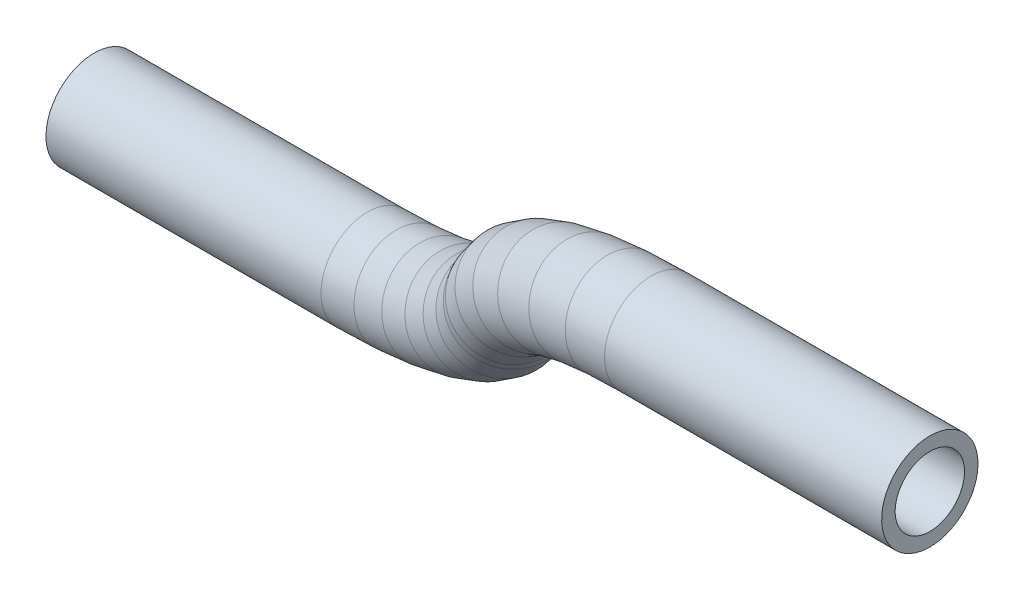
ISO-10303-21;
HEADER;
FILE_DESCRIPTION(('STEP AP214'),'2;1');
FILE_NAME('part.step','',(''),(''),'','','');
FILE_SCHEMA(('AUTOMOTIVE_DESIGN { 1 0 10303 214 1 1 1 1 }'));
ENDSEC;
DATA;
#1=APPLICATION_CONTEXT('core data for automotive mechanical design processes');
#2=APPLICATION_PROTOCOL_DEFINITION('international standard','automotive_design',2000,#1);
#3=PRODUCT_CONTEXT('',#1,'mechanical');
#4=PRODUCT('Part','Part','',(#3));
#5=PRODUCT_RELATED_PRODUCT_CATEGORY('part','',(#4));
#6=PRODUCT_DEFINITION_FORMATION('','',#4);
#7=PRODUCT_DEFINITION_CONTEXT('part definition',#1,'design');
#8=PRODUCT_DEFINITION('design','',#6,#7);
#9=PRODUCT_DEFINITION_SHAPE('','',#8);
#10=(LENGTH_UNIT() NAMED_UNIT(*) SI_UNIT(.MILLI.,.METRE.));
#11=(NAMED_UNIT(*) PLANE_ANGLE_UNIT() SI_UNIT($,.RADIAN.));
#12=(NAMED_UNIT(*) SI_UNIT($,.STERADIAN.) SOLID_ANGLE_UNIT());
#13=UNCERTAINTY_MEASURE_WITH_UNIT(LENGTH_MEASURE(1.E-05),#10,'distance_accuracy_value','');
#14=(GEOMETRIC_REPRESENTATION_CONTEXT(3) GLOBAL_UNCERTAINTY_ASSIGNED_CONTEXT((#13)) GLOBAL_UNIT_ASSIGNED_CONTEXT((#10,
#11,#12)) REPRESENTATION_CONTEXT('',''));
#15=CARTESIAN_POINT('',(0.,0.,0.));
#16=DIRECTION('',(0.,0.,1.));
#17=DIRECTION('',(1.,0.,0.));
#18=AXIS2_PLACEMENT_3D('',#15,#16,#17);
#19=CARTESIAN_POINT('',(-74.8208479167537,-28.,-24.));
#20=DIRECTION('',(-1.,0.,0.));
#21=DIRECTION('',(0.,0.,1.));
#22=AXIS2_PLACEMENT_3D('',#19,#20,#21);
#23=CYLINDRICAL_SURFACE('',#22,3.175);
#24=CARTESIAN_POINT('',(-75.2453160550271,-28.,-24.));
#25=DIRECTION('',(-0.999136472758387,-0.0363487931589792,-0.0201264512473963));
#26=DIRECTION('',(0.0415488724748106,-0.874088821734079,-0.483985973883131));
#27=AXIS2_PLACEMENT_3D('',#24,#25,#26);
#28=ELLIPSE('',#27,3.17774406857008,3.175);
#29=CARTESIAN_POINT('',(-75.1132843719645,-30.7776305686688,-25.5379835577782));
#30=VERTEX_POINT('',#29);
#31=EDGE_CURVE('E45',#30,#30,#28,.T.);
#32=ORIENTED_EDGE('',*,*,#31,.T.);
#33=EDGE_LOOP('',(#32));
#34=FACE_BOUND('',#33,.T.);
#35=CARTESIAN_POINT('',(-93.4453160550271,-28.,-24.));
#36=DIRECTION('',(1.,0.,0.));
#37=DIRECTION('',(0.,0.,-1.));
#38=AXIS2_PLACEMENT_3D('',#35,#36,#37);
#39=CIRCLE('',#38,3.175);
#40=CARTESIAN_POINT('',(-93.4453160550271,-28.,-27.175));
#41=VERTEX_POINT('',#40);
#42=EDGE_CURVE('E98',#41,#41,#39,.T.);
#43=ORIENTED_EDGE('',*,*,#42,.T.);
#44=EDGE_LOOP('',(#43));
#45=FACE_BOUND('',#44,.T.);
#46=ADVANCED_FACE('F39',(#34,#45),#23,.T.);
#47=CARTESIAN_POINT('',(-72.0156653807741,-27.7646021984058,-23.8696594311451));
#48=DIRECTION('',(-0.996547382392144,-0.0726348099717733,-0.0402181430169344));
#49=DIRECTION('',(0.0726936246982249,-0.997354318649212,0.));
#50=AXIS2_PLACEMENT_3D('',#47,#48,#49);
#51=CYLINDRICAL_SURFACE('',#50,3.175);
#52=CARTESIAN_POINT('',(-72.7631361311528,-27.8190826946396,-23.8998254684765));
#53=DIRECTION('',(-0.986213370705267,-0.144768059495844,-0.0801585702963985));
#54=DIRECTION('',(0.165478661591623,-0.862783119905803,-0.477725968064804));
#55=AXIS2_PLACEMENT_3D('',#52,#53,#54);
#56=ELLIPSE('',#55,3.18600003983617,3.175);
#57=CARTESIAN_POINT('',(-72.2359211087298,-30.5679097490294,-25.4218604217617));
#58=VERTEX_POINT('',#57);
#59=EDGE_CURVE('E136',#58,#58,#56,.T.);
#60=ORIENTED_EDGE('',*,*,#59,.T.);
#61=EDGE_LOOP('',(#60));
#62=FACE_BOUND('',#61,.T.);
#63=ORIENTED_EDGE('',*,*,#31,.F.);
#64=EDGE_LOOP('',(#63));
#65=FACE_BOUND('',#64,.T.);
#66=ADVANCED_FACE('F144',(#62,#65),#51,.T.);
#67=CARTESIAN_POINT('',(-69.6225374500946,-27.1193799743117,-23.5123976761215));
#68=DIRECTION('',(-0.96906932372079,-0.215901651517374,-0.119545483793411));
#69=DIRECTION('',(0.217461125033716,-0.976068982756378,0.));
#70=AXIS2_PLACEMENT_3D('',#67,#68,#69);
#71=CYLINDRICAL_SURFACE('',#70,3.175);
#72=CARTESIAN_POINT('',(-70.349397996185,-27.2813192582023,-23.6020640121676));
#73=DIRECTION('',(-0.945233625115691,-0.285544391851714,-0.158106907605852));
#74=DIRECTION('',(0.326394537256141,-0.826932224143323,-0.457875204310877));
#75=AXIS2_PLACEMENT_3D('',#72,#73,#74);
#76=ELLIPSE('',#75,3.18600003983617,3.175);
#77=CARTESIAN_POINT('',(-69.3095049874846,-29.9159253572647,-25.0608544313421));
#78=VERTEX_POINT('',#77);
#79=EDGE_CURVE('E131',#78,#78,#76,.T.);
#80=ORIENTED_EDGE('',*,*,#79,.T.);
#81=EDGE_LOOP('',(#80));
#82=FACE_BOUND('',#81,.T.);
#83=ORIENTED_EDGE('',*,*,#59,.F.);
#84=EDGE_LOOP('',(#83));
#85=FACE_BOUND('',#84,.T.);
#86=ADVANCED_FACE('F150',(#82,#85),#71,.T.);
#87=CARTESIAN_POINT('',(-67.3844478478801,-26.1366047031841,-22.968231643016));
#88=DIRECTION('',(-0.914870865995366,-0.35321538099579,-0.195576566032046));
#89=DIRECTION('',(0.360170843602373,-0.932886361471082,0.));
#90=AXIS2_PLACEMENT_3D('',#87,#88,#89);
#91=CYLINDRICAL_SURFACE('',#90,3.175);
#92=CARTESIAN_POINT('',(-68.0706562758865,-26.4015375809811,-23.1149258847063));
#93=DIRECTION('',(-0.878190708353341,-0.418447334852284,-0.231695722267109));
#94=DIRECTION('',(0.478310651942706,-0.768280112328567,-0.4253993291468));
#95=AXIS2_PLACEMENT_3D('',#92,#93,#94);
#96=ELLIPSE('',#95,3.18600003983617,3.175);
#97=CARTESIAN_POINT('',(-66.546758519743,-28.8492780494652,-24.4702481643143));
#98=VERTEX_POINT('',#97);
#99=EDGE_CURVE('E132',#98,#98,#96,.T.);
#100=ORIENTED_EDGE('',*,*,#99,.T.);
#101=EDGE_LOOP('',(#100));
#102=FACE_BOUND('',#101,.T.);
#103=ORIENTED_EDGE('',*,*,#79,.F.);
#104=EDGE_LOOP('',(#103));
#105=FACE_BOUND('',#104,.T.);
#106=ADVANCED_FACE('F155',(#102,#105),#91,.T.);
#107=CARTESIAN_POINT('',(-65.3631079974791,-24.8433747017092,-22.2521657625749));
#108=DIRECTION('',(-0.835446437305883,-0.480789811436235,-0.266214965041444));
#109=DIRECTION('',(0.498789278388095,-0.866723286732902,0.));
#110=AXIS2_PLACEMENT_3D('',#107,#108,#109);
#111=CYLINDRICAL_SURFACE('',#110,3.175);
#112=CARTESIAN_POINT('',(-65.9897433049697,-25.2039961106642,-22.4518430716497));
#113=DIRECTION('',(-0.786933212098699,-0.539812321282901,-0.298895930864223));
#114=DIRECTION('',(0.617038183337162,-0.688444014307449,-0.381193808276342));
#115=AXIS2_PLACEMENT_3D('',#112,#113,#114);
#116=ELLIPSE('',#115,3.18600003983617,3.175);
#117=CARTESIAN_POINT('',(-64.0238596282771,-27.3973787676727,-23.6663265600034));
#118=VERTEX_POINT('',#117);
#119=EDGE_CURVE('E126',#118,#118,#116,.T.);
#120=ORIENTED_EDGE('',*,*,#119,.T.);
#121=EDGE_LOOP('',(#120));
#122=FACE_BOUND('',#121,.T.);
#123=ORIENTED_EDGE('',*,*,#99,.F.);
#124=EDGE_LOOP('',(#123));
#125=FACE_BOUND('',#124,.T.);
#126=ADVANCED_FACE('F266',(#122,#125),#111,.T.);
#127=CARTESIAN_POINT('',(-63.6142528252838,-23.2753485351333,-21.3839443044868));
#128=DIRECTION('',(-0.732986027962917,-0.595107300078769,-0.329512949979365));
#129=DIRECTION('',(0.630309415582673,-0.77634402208546,0.));
#130=AXIS2_PLACEMENT_3D('',#127,#128,#129);
#131=CYLINDRICAL_SURFACE('',#130,3.175);
#132=CARTESIAN_POINT('',(-64.1640366348838,-23.7217149678843,-21.6310989268685));
#133=DIRECTION('',(-0.67397740289422,-0.646292922989005,-0.357854604668277));
#134=DIRECTION('',(0.738751961342886,-0.589625271455446,-0.326477531957606));
#135=AXIS2_PLACEMENT_3D('',#132,#133,#134);
#136=ELLIPSE('',#135,3.18600003983617,3.175);
#137=CARTESIAN_POINT('',(-61.8103728566164,-25.6002611062297,-22.671256356691));
#138=VERTEX_POINT('',#137);
#139=EDGE_CURVE('E125',#138,#138,#136,.T.);
#140=ORIENTED_EDGE('',*,*,#139,.T.);
#141=EDGE_LOOP('',(#140));
#142=FACE_BOUND('',#141,.T.);
#143=ORIENTED_EDGE('',*,*,#119,.F.);
#144=EDGE_LOOP('',(#143));
#145=FACE_BOUND('',#144,.T.);
#146=ADVANCED_FACE('F265',(#142,#145),#131,.T.);
#147=CARTESIAN_POINT('',(-62.3848177585732,-21.7014023724119,-20.5124449242601));
#148=DIRECTION('',(-0.610314805328465,-0.693015741247752,-0.38372518913893));
#149=DIRECTION('',(0.75046590694347,-0.6609091635887,0.));
#150=AXIS2_PLACEMENT_3D('',#147,#148,#149);
#151=CYLINDRICAL_SURFACE('',#150,3.175);
#152=CARTESIAN_POINT('',(-62.6438769477517,-21.9955654738935,-20.6753240409025));
#153=DIRECTION('',(-0.576874469721973,-0.714601509897064,-0.395677303159821));
#154=DIRECTION('',(0.81683281409539,-0.504675326420293,-0.279440456483269));
#155=AXIS2_PLACEMENT_3D('',#152,#153,#154);
#156=ELLIPSE('',#155,3.17774406857008,3.175);
#157=CARTESIAN_POINT('',(-60.0481913177467,-23.5992944989792,-21.5633142940107));
#158=VERTEX_POINT('',#157);
#159=EDGE_CURVE('E122',#158,#158,#156,.T.);
#160=ORIENTED_EDGE('',*,*,#159,.T.);
#161=EDGE_LOOP('',(#160));
#162=FACE_BOUND('',#161,.T.);
#163=ORIENTED_EDGE('',*,*,#139,.F.);
#164=EDGE_LOOP('',(#163));
#165=FACE_BOUND('',#164,.T.);
#166=ADVANCED_FACE('F256',(#162,#165),#151,.T.);
#167=CARTESIAN_POINT('',(-61.8711915269994,-20.9486481673332,-20.0956423431255));
#168=DIRECTION('',(-0.542437840476289,-0.73495312280499,-0.406946060920381));
#169=DIRECTION('',(0.804588494957021,-0.593832765837989,0.));
#170=AXIS2_PLACEMENT_3D('',#167,#168,#169);
#171=CYLINDRICAL_SURFACE('',#170,3.175);
#172=CARTESIAN_POINT('',(-62.1014391072754,-21.2606123510885,-20.2683779799821));
#173=DIRECTION('',(-0.576874469721973,-0.714601509897064,-0.395677303159821));
#174=DIRECTION('',(-0.816832814095389,0.504675326420297,0.279440456483263));
#175=AXIS2_PLACEMENT_3D('',#172,#173,#174);
#176=ELLIPSE('',#175,3.17774406857008,3.175);
#177=CARTESIAN_POINT('',(-64.6971247372804,-19.6568833260027,-19.3803877268739));
#178=VERTEX_POINT('',#177);
#179=EDGE_CURVE('E116',#178,#178,#176,.T.);
#180=ORIENTED_EDGE('',*,*,#179,.T.);
#181=EDGE_LOOP('',(#180));
#182=FACE_BOUND('',#181,.T.);
#183=ORIENTED_EDGE('',*,*,#159,.F.);
#184=EDGE_LOOP('',(#183));
#185=FACE_BOUND('',#184,.T.);
#186=ADVANCED_FACE('F255',(#182,#185),#171,.T.);
#187=CARTESIAN_POINT('',(-60.1235064395841,-19.0146591776266,-19.0247860166421));
#188=DIRECTION('',(-0.610314805328466,-0.693015741247751,-0.38372518913893));
#189=DIRECTION('',(0.75046590694347,-0.6609091635887,0.));
#190=AXIS2_PLACEMENT_3D('',#187,#188,#189);
#191=CYLINDRICAL_SURFACE('',#190,3.175);
#192=CARTESIAN_POINT('',(-60.5812794201433,-19.5344628570977,-19.3126030940162));
#193=DIRECTION('',(-0.673977402894222,-0.646292922989004,-0.357854604668278));
#194=DIRECTION('',(-0.738751961342885,0.589625271455447,0.326477531957608));
#195=AXIS2_PLACEMENT_3D('',#192,#193,#194);
#196=ELLIPSE('',#195,3.18600003983617,3.175);
#197=CARTESIAN_POINT('',(-62.9349431984108,-17.6559167187522,-18.2724456641936));
#198=VERTEX_POINT('',#197);
#199=EDGE_CURVE('E117',#198,#198,#196,.T.);
#200=ORIENTED_EDGE('',*,*,#199,.T.);
#201=EDGE_LOOP('',(#200));
#202=FACE_BOUND('',#201,.T.);
#203=ORIENTED_EDGE('',*,*,#179,.F.);
#204=EDGE_LOOP('',(#203));
#205=FACE_BOUND('',#204,.T.);
#206=ADVANCED_FACE('F250',(#202,#205),#191,.T.);
#207=CARTESIAN_POINT('',(-58.2057889404573,-17.6058152815667,-18.2447043268533));
#208=DIRECTION('',(-0.732986027962918,-0.595107300078768,-0.329512949979365));
#209=DIRECTION('',(0.630309415582671,-0.776344022085462,0.));
#210=AXIS2_PLACEMENT_3D('',#207,#208,#209);
#211=CYLINDRICAL_SURFACE('',#210,3.175);
#212=CARTESIAN_POINT('',(-58.7555727500574,-18.0521817143177,-18.4918589492349));
#213=DIRECTION('',(-0.7869332120987,-0.5398123212829,-0.298895930864222));
#214=DIRECTION('',(-0.61703818333716,0.688444014307445,0.381193808276351));
#215=AXIS2_PLACEMENT_3D('',#212,#213,#214);
#216=ELLIPSE('',#215,3.18600003983617,3.175);
#217=CARTESIAN_POINT('',(-60.72145642675,-15.8587990573093,-17.2773754608812));
#218=VERTEX_POINT('',#217);
#219=EDGE_CURVE('E114',#218,#218,#216,.T.);
#220=ORIENTED_EDGE('',*,*,#219,.T.);
#221=EDGE_LOOP('',(#220));
#222=FACE_BOUND('',#221,.T.);
#223=ORIENTED_EDGE('',*,*,#199,.F.);
#224=EDGE_LOOP('',(#223));
#225=FACE_BOUND('',#224,.T.);
#226=ADVANCED_FACE('F246',(#222,#225),#211,.T.);
#227=CARTESIAN_POINT('',(-56.04802447165,-16.4940188350458,-17.6290988271036));
#228=DIRECTION('',(-0.835446437305884,-0.480789811436234,-0.266214965041442));
#229=DIRECTION('',(0.498789278388093,-0.866723286732902,0.));
#230=AXIS2_PLACEMENT_3D('',#227,#228,#229);
#231=CYLINDRICAL_SURFACE('',#230,3.175);
#232=CARTESIAN_POINT('',(-56.6746597791406,-16.8546402440008,-17.8287761361783));
#233=DIRECTION('',(-0.878190708353341,-0.418447334852285,-0.231695722267108));
#234=DIRECTION('',(-0.478310651942707,0.768280112328569,0.425399329146797));
#235=AXIS2_PLACEMENT_3D('',#232,#233,#234);
#236=ELLIPSE('',#235,3.18600003983617,3.175);
#237=CARTESIAN_POINT('',(-58.1985575352841,-14.4068997755167,-16.4734538565704));
#238=VERTEX_POINT('',#237);
#239=EDGE_CURVE('E109',#238,#238,#236,.T.);
#240=ORIENTED_EDGE('',*,*,#239,.T.);
#241=EDGE_LOOP('',(#240));
#242=FACE_BOUND('',#241,.T.);
#243=ORIENTED_EDGE('',*,*,#219,.F.);
#244=EDGE_LOOP('',(#243));
#245=FACE_BOUND('',#244,.T.);
#246=ADVANCED_FACE('F245',(#242,#245),#231,.T.);
#247=CARTESIAN_POINT('',(-53.7097096308357,-15.7099256889826,-17.1949437670267));
#248=DIRECTION('',(-0.914870865995365,-0.353215380995792,-0.195576566032046));
#249=DIRECTION('',(0.360170843602375,-0.932886361471081,0.));
#250=AXIS2_PLACEMENT_3D('',#247,#248,#249);
#251=CYLINDRICAL_SURFACE('',#250,3.175);
#252=CARTESIAN_POINT('',(-54.3959180588421,-15.9748585667796,-17.341638008717));
#253=DIRECTION('',(-0.94523362511569,-0.285544391851714,-0.158106907605852));
#254=DIRECTION('',(-0.326394537256141,0.826932224143329,0.457875204310866));
#255=AXIS2_PLACEMENT_3D('',#252,#253,#254);
#256=ELLIPSE('',#255,3.18600003983617,3.175);
#257=CARTESIAN_POINT('',(-55.4358110675425,-13.3402524677172,-15.8828475895426));
#258=VERTEX_POINT('',#257);
#259=EDGE_CURVE('E110',#258,#258,#256,.T.);
#260=ORIENTED_EDGE('',*,*,#259,.T.);
#261=EDGE_LOOP('',(#260));
#262=FACE_BOUND('',#261,.T.);
#263=ORIENTED_EDGE('',*,*,#239,.F.);
#264=EDGE_LOOP('',(#263));
#265=FACE_BOUND('',#264,.T.);
#266=ADVANCED_FACE('F236',(#262,#265),#251,.T.);
#267=CARTESIAN_POINT('',(-51.2553193777839,-15.2751558464517,-16.954210216362));
#268=DIRECTION('',(-0.969069323720791,-0.215901651517371,-0.119545483793411));
#269=DIRECTION('',(0.217461125033713,-0.976068982756379,0.));
#270=AXIS2_PLACEMENT_3D('',#267,#268,#269);
#271=CYLINDRICAL_SURFACE('',#270,3.175);
#272=CARTESIAN_POINT('',(-51.9821799238743,-15.4370951303424,-17.0438765524081));
#273=DIRECTION('',(-0.986213370705268,-0.144768059495843,-0.0801585702963986));
#274=DIRECTION('',(-0.165478661591622,0.862783119905798,0.477725968064813));
#275=AXIS2_PLACEMENT_3D('',#272,#273,#274);
#276=ELLIPSE('',#275,3.18600003983617,3.175);
#277=CARTESIAN_POINT('',(-52.5093949462973,-12.6882680759525,-15.5218415991229));
#278=VERTEX_POINT('',#277);
#279=EDGE_CURVE('E102',#278,#278,#276,.T.);
#280=ORIENTED_EDGE('',*,*,#279,.T.);
#281=EDGE_LOOP('',(#280));
#282=FACE_BOUND('',#281,.T.);
#283=ORIENTED_EDGE('',*,*,#259,.F.);
#284=EDGE_LOOP('',(#283));
#285=FACE_BOUND('',#284,.T.);
#286=ADVANCED_FACE('F233',(#282,#285),#271,.T.);
#287=CARTESIAN_POINT('',(-49.0769973878947,-15.2253466624194,-16.9266307005934));
#288=DIRECTION('',(-0.996547382392144,-0.072634809971774,-0.0402181430169344));
#289=DIRECTION('',(0.0726936246982257,-0.997354318649212,0.));
#290=AXIS2_PLACEMENT_3D('',#287,#288,#289);
#291=CYLINDRICAL_SURFACE('',#290,3.175);
#292=CARTESIAN_POINT('',(-49.5,-15.256177824982,-16.9437020208846));
#293=DIRECTION('',(-0.999136472758387,-0.0363487931589795,-0.0201264512473963));
#294=DIRECTION('',(-0.0415488724748109,0.87408882173408,0.483985973883127));
#295=AXIS2_PLACEMENT_3D('',#292,#293,#294);
#296=ELLIPSE('',#295,3.17774406857008,3.175);
#297=CARTESIAN_POINT('',(-49.6320316830626,-12.4785472563131,-15.4057184631064));
#298=VERTEX_POINT('',#297);
#299=EDGE_CURVE('E101',#298,#298,#296,.T.);
#300=ORIENTED_EDGE('',*,*,#299,.T.);
#301=EDGE_LOOP('',(#300));
#302=FACE_BOUND('',#301,.T.);
#303=ORIENTED_EDGE('',*,*,#279,.F.);
#304=EDGE_LOOP('',(#303));
#305=FACE_BOUND('',#304,.T.);
#306=ADVANCED_FACE('F228',(#302,#305),#291,.T.);
#307=CARTESIAN_POINT('',(-31.3,-15.256177824982,-16.9437020208846));
#308=DIRECTION('',(-1.,0.,0.));
#309=DIRECTION('',(0.,0.,1.));
#310=AXIS2_PLACEMENT_3D('',#307,#308,#309);
#311=CYLINDRICAL_SURFACE('',#310,3.175);
#312=CARTESIAN_POINT('',(-31.3,-15.256177824982,-16.9437020208846));
#313=DIRECTION('',(1.,0.,0.));
#314=DIRECTION('',(0.,0.,-1.));
#315=AXIS2_PLACEMENT_3D('',#312,#313,#314);
#316=CIRCLE('',#315,3.175);
#317=CARTESIAN_POINT('',(-31.3,-15.256177824982,-20.1187020208846));
#318=VERTEX_POINT('',#317);
#319=EDGE_CURVE('E92',#318,#318,#316,.T.);
#320=ORIENTED_EDGE('',*,*,#319,.F.);
#321=EDGE_LOOP('',(#320));
#322=FACE_BOUND('',#321,.T.);
#323=ORIENTED_EDGE('',*,*,#299,.F.);
#324=EDGE_LOOP('',(#323));
#325=FACE_BOUND('',#324,.T.);
#326=ADVANCED_FACE('F227',(#322,#325),#311,.T.);
#327=CARTESIAN_POINT('',(-93.4453160550271,-28.,-24.));
#328=DIRECTION('',(1.,0.,0.));
#329=DIRECTION('',(0.,0.,-1.));
#330=AXIS2_PLACEMENT_3D('',#327,#328,#329);
#331=PLANE('',#330);
#332=CARTESIAN_POINT('',(-93.4453160550271,-28.,-24.));
#333=DIRECTION('',(1.,0.,0.));
#334=DIRECTION('',(0.,0.,-1.));
#335=AXIS2_PLACEMENT_3D('',#332,#333,#334);
#336=CIRCLE('',#335,2.286);
#337=CARTESIAN_POINT('',(-93.4453160550271,-28.,-26.286));
#338=VERTEX_POINT('',#337);
#339=EDGE_CURVE('E95',#338,#338,#336,.F.);
#340=ORIENTED_EDGE('',*,*,#339,.F.);
#341=EDGE_LOOP('',(#340));
#342=FACE_BOUND('',#341,.T.);
#343=ORIENTED_EDGE('',*,*,#42,.F.);
#344=EDGE_LOOP('',(#343));
#345=FACE_BOUND('',#344,.T.);
#346=ADVANCED_FACE('F225',(#342,#345),#331,.F.);
#347=CARTESIAN_POINT('',(-31.3,-15.256177824982,-16.9437020208846));
#348=DIRECTION('',(1.,0.,0.));
#349=DIRECTION('',(0.,0.,-1.));
#350=AXIS2_PLACEMENT_3D('',#347,#348,#349);
#351=PLANE('',#350);
#352=CARTESIAN_POINT('',(-31.3,-15.256177824982,-16.9437020208846));
#353=DIRECTION('',(1.,0.,0.));
#354=DIRECTION('',(0.,0.,-1.));
#355=AXIS2_PLACEMENT_3D('',#352,#353,#354);
#356=CIRCLE('',#355,2.286);
#357=CARTESIAN_POINT('',(-31.3,-15.256177824982,-19.2297020208846));
#358=VERTEX_POINT('',#357);
#359=EDGE_CURVE('E46',#358,#358,#356,.F.);
#360=ORIENTED_EDGE('',*,*,#359,.T.);
#361=EDGE_LOOP('',(#360));
#362=FACE_BOUND('',#361,.T.);
#363=ORIENTED_EDGE('',*,*,#319,.T.);
#364=EDGE_LOOP('',(#363));
#365=FACE_BOUND('',#364,.T.);
#366=ADVANCED_FACE('F217',(#362,#365),#351,.T.);
#367=CARTESIAN_POINT('',(-74.9116989954702,-28.,-24.));
#368=DIRECTION('',(-1.,0.,0.));
#369=DIRECTION('',(0.,0.,1.));
#370=AXIS2_PLACEMENT_3D('',#367,#368,#369);
#371=CYLINDRICAL_SURFACE('',#370,2.286);
#372=CARTESIAN_POINT('',(-75.2453160550271,-28.,-24.));
#373=DIRECTION('',(-0.999136472758387,-0.0363487931589792,-0.0201264512473963));
#374=DIRECTION('',(0.0415488724748106,-0.874088821734078,-0.483985973883131));
#375=AXIS2_PLACEMENT_3D('',#372,#373,#374);
#376=ELLIPSE('',#375,2.28797572937046,2.286);
#377=CARTESIAN_POINT('',(-75.150253243222,-29.9998940094416,-25.1073481616003));
#378=VERTEX_POINT('',#377);
#379=EDGE_CURVE('E90',#378,#378,#376,.F.);
#380=ORIENTED_EDGE('',*,*,#379,.T.);
#381=EDGE_LOOP('',(#380));
#382=FACE_BOUND('',#381,.T.);
#383=ORIENTED_EDGE('',*,*,#339,.T.);
#384=EDGE_LOOP('',(#383));
#385=FACE_BOUND('',#384,.T.);
#386=ADVANCED_FACE('F212',(#382,#385),#371,.F.);
#387=CARTESIAN_POINT('',(-72.1970538641731,-27.777822962672,-23.8769798135934));
#388=DIRECTION('',(-0.996547382392144,-0.0726348099717733,-0.0402181430169344));
#389=DIRECTION('',(0.072693624698225,-0.997354318649212,0.));
#390=AXIS2_PLACEMENT_3D('',#387,#388,#389);
#391=CYLINDRICAL_SURFACE('',#390,2.286);
#392=CARTESIAN_POINT('',(-72.7631361311528,-27.8190826946395,-23.8998254684765));
#393=DIRECTION('',(-0.986213370705267,-0.144768059495844,-0.0801585702963985));
#394=DIRECTION('',(0.165478661591623,-0.862783119905803,-0.477725968064804));
#395=AXIS2_PLACEMENT_3D('',#392,#393,#394);
#396=ELLIPSE('',#395,2.29392002868204,2.286);
#397=CARTESIAN_POINT('',(-72.3835413150082,-29.7982381738003,-24.9956906348418));
#398=VERTEX_POINT('',#397);
#399=EDGE_CURVE('E88',#398,#398,#396,.F.);
#400=ORIENTED_EDGE('',*,*,#399,.T.);
#401=EDGE_LOOP('',(#400));
#402=FACE_BOUND('',#401,.T.);
#403=ORIENTED_EDGE('',*,*,#379,.F.);
#404=EDGE_LOOP('',(#403));
#405=FACE_BOUND('',#404,.T.);
#406=ADVANCED_FACE('F209',(#402,#405),#391,.F.);
#407=CARTESIAN_POINT('',(-69.7989244619357,-27.1586777275585,-23.5341569766682));
#408=DIRECTION('',(-0.96906932372079,-0.215901651517374,-0.119545483793411));
#409=DIRECTION('',(0.217461125033716,-0.976068982756378,0.));
#410=AXIS2_PLACEMENT_3D('',#407,#408,#409);
#411=CYLINDRICAL_SURFACE('',#410,2.286);
#412=CARTESIAN_POINT('',(-70.349397996185,-27.2813192582023,-23.6020640121676));
#413=DIRECTION('',(-0.94523362511569,-0.285544391851714,-0.158106907605852));
#414=DIRECTION('',(0.326394537256141,-0.826932224143322,-0.457875204310877));
#415=AXIS2_PLACEMENT_3D('',#412,#413,#414);
#416=ELLIPSE('',#415,2.29392002868204,2.286);
#417=CARTESIAN_POINT('',(-69.6006750299207,-29.1782356495273,-24.6523931139732));
#418=VERTEX_POINT('',#417);
#419=EDGE_CURVE('E84',#418,#418,#416,.F.);
#420=ORIENTED_EDGE('',*,*,#419,.T.);
#421=EDGE_LOOP('',(#420));
#422=FACE_BOUND('',#421,.T.);
#423=ORIENTED_EDGE('',*,*,#399,.F.);
#424=EDGE_LOOP('',(#423));
#425=FACE_BOUND('',#424,.T.);
#426=ADVANCED_FACE('F206',(#422,#425),#411,.F.);
#427=CARTESIAN_POINT('',(-67.550969823474,-26.2008958782994,-23.0038298868404));
#428=DIRECTION('',(-0.914870865995366,-0.35321538099579,-0.195576566032046));
#429=DIRECTION('',(0.360170843602373,-0.932886361471082,0.));
#430=AXIS2_PLACEMENT_3D('',#427,#428,#429);
#431=CYLINDRICAL_SURFACE('',#430,2.286);
#432=CARTESIAN_POINT('',(-68.0706562758865,-26.4015375809811,-23.1149258847063));
#433=DIRECTION('',(-0.878190708353341,-0.418447334852284,-0.231695722267109));
#434=DIRECTION('',(0.478310651942706,-0.768280112328568,-0.425399329146799));
#435=AXIS2_PLACEMENT_3D('',#432,#433,#434);
#436=ELLIPSE('',#435,2.29392002868204,2.286);
#437=CARTESIAN_POINT('',(-66.9734498914632,-28.1639107182897,-24.090757926024));
#438=VERTEX_POINT('',#437);
#439=EDGE_CURVE('E78',#438,#438,#436,.F.);
#440=ORIENTED_EDGE('',*,*,#439,.T.);
#441=EDGE_LOOP('',(#440));
#442=FACE_BOUND('',#441,.T.);
#443=ORIENTED_EDGE('',*,*,#419,.F.);
#444=EDGE_LOOP('',(#443));
#445=FACE_BOUND('',#444,.T.);
#446=ADVANCED_FACE('F205',(#442,#445),#431,.F.);
#447=CARTESIAN_POINT('',(-65.5151733833319,-24.9308865814964,-22.3006213900947));
#448=DIRECTION('',(-0.835446437305883,-0.480789811436235,-0.266214965041444));
#449=DIRECTION('',(0.498789278388094,-0.866723286732902,0.));
#450=AXIS2_PLACEMENT_3D('',#447,#448,#449);
#451=CYLINDRICAL_SURFACE('',#450,2.286);
#452=CARTESIAN_POINT('',(-65.9897433049697,-25.2039961106642,-22.4518430716497));
#453=DIRECTION('',(-0.786933212098698,-0.539812321282901,-0.298895930864223));
#454=DIRECTION('',(0.617038183337162,-0.688444014307449,-0.381193808276342));
#455=AXIS2_PLACEMENT_3D('',#452,#453,#454);
#456=ELLIPSE('',#455,2.29392002868204,2.286);
#457=CARTESIAN_POINT('',(-64.574307057751,-26.7832316237103,-23.3262711832643));
#458=VERTEX_POINT('',#457);
#459=EDGE_CURVE('E80',#458,#458,#456,.F.);
#460=ORIENTED_EDGE('',*,*,#459,.T.);
#461=EDGE_LOOP('',(#460));
#462=FACE_BOUND('',#461,.T.);
#463=ORIENTED_EDGE('',*,*,#439,.F.);
#464=EDGE_LOOP('',(#463));
#465=FACE_BOUND('',#464,.T.);
#466=ADVANCED_FACE('F196',(#462,#465),#451,.F.);
#467=CARTESIAN_POINT('',(-63.7476686831888,-23.3836681319013,-21.4439212361542));
#468=DIRECTION('',(-0.732986027962917,-0.595107300078769,-0.329512949979365));
#469=DIRECTION('',(0.630309415582673,-0.77634402208546,0.));
#470=AXIS2_PLACEMENT_3D('',#467,#468,#469);
#471=CYLINDRICAL_SURFACE('',#470,2.286);
#472=CARTESIAN_POINT('',(-64.1640366348838,-23.7217149678843,-21.6310989268685));
#473=DIRECTION('',(-0.673977402894221,-0.646292922989005,-0.357854604668277));
#474=DIRECTION('',(0.738751961342886,-0.589625271455446,-0.326477531957607));
#475=AXIS2_PLACEMENT_3D('',#472,#473,#474);
#476=ELLIPSE('',#475,2.29392002868204,2.286);
#477=CARTESIAN_POINT('',(-62.4693987145313,-25.074268187493,-22.3800122763407));
#478=VERTEX_POINT('',#477);
#479=EDGE_CURVE('E74',#478,#478,#476,.F.);
#480=ORIENTED_EDGE('',*,*,#479,.T.);
#481=EDGE_LOOP('',(#480));
#482=FACE_BOUND('',#481,.T.);
#483=ORIENTED_EDGE('',*,*,#459,.F.);
#484=EDGE_LOOP('',(#483));
#485=FACE_BOUND('',#484,.T.);
#486=ADVANCED_FACE('F193',(#482,#485),#471,.F.);
#487=CARTESIAN_POINT('',(-62.440265516994,-21.7643636000718,-20.5473067716241));
#488=DIRECTION('',(-0.610314805328465,-0.693015741247752,-0.38372518913893));
#489=DIRECTION('',(0.75046590694347,-0.660909163588699,0.));
#490=AXIS2_PLACEMENT_3D('',#487,#488,#489);
#491=CYLINDRICAL_SURFACE('',#490,2.286);
#492=CARTESIAN_POINT('',(-62.6438769477517,-21.9955654738935,-20.6753240409025));
#493=DIRECTION('',(-0.576874469721973,-0.714601509897064,-0.395677303159821));
#494=DIRECTION('',(0.81683281409539,-0.504675326420294,-0.279440456483268));
#495=AXIS2_PLACEMENT_3D('',#492,#493,#494);
#496=ELLIPSE('',#495,2.28797572937046,2.286);
#497=CARTESIAN_POINT('',(-60.7749832941481,-23.1502503719552,-21.3146770231404));
#498=VERTEX_POINT('',#497);
#499=EDGE_CURVE('E72',#498,#498,#496,.F.);
#500=ORIENTED_EDGE('',*,*,#499,.T.);
#501=EDGE_LOOP('',(#500));
#502=FACE_BOUND('',#501,.T.);
#503=ORIENTED_EDGE('',*,*,#479,.F.);
#504=EDGE_LOOP('',(#503));
#505=FACE_BOUND('',#504,.T.);
#506=ADVANCED_FACE('F188',(#502,#505),#491,.F.);
#507=CARTESIAN_POINT('',(-61.9204725899433,-21.0154194513461,-20.1326138317396));
#508=DIRECTION('',(-0.542437840476289,-0.734953122804989,-0.406946060920381));
#509=DIRECTION('',(0.804588494957021,-0.593832765837989,0.));
#510=AXIS2_PLACEMENT_3D('',#507,#508,#509);
#511=CYLINDRICAL_SURFACE('',#510,2.286);
#512=CARTESIAN_POINT('',(-62.1014391072754,-21.2606123510885,-20.2683779799821));
#513=DIRECTION('',(-0.576874469721973,-0.714601509897064,-0.395677303159822));
#514=DIRECTION('',(-0.816832814095389,0.504675326420296,0.279440456483264));
#515=AXIS2_PLACEMENT_3D('',#512,#513,#514);
#516=ELLIPSE('',#515,2.28797572937046,2.286);
#517=CARTESIAN_POINT('',(-63.970332760879,-20.1059274530267,-19.6290249977442));
#518=VERTEX_POINT('',#517);
#519=EDGE_CURVE('E69',#518,#518,#516,.F.);
#520=ORIENTED_EDGE('',*,*,#519,.T.);
#521=EDGE_LOOP('',(#520));
#522=FACE_BOUND('',#521,.T.);
#523=ORIENTED_EDGE('',*,*,#499,.F.);
#524=EDGE_LOOP('',(#523));
#525=FACE_BOUND('',#524,.T.);
#526=ADVANCED_FACE('F187',(#522,#525),#511,.F.);
#527=CARTESIAN_POINT('',(-60.2345940595915,-19.1407997671236,-19.0946304930109));
#528=DIRECTION('',(-0.610314805328466,-0.693015741247751,-0.38372518913893));
#529=DIRECTION('',(0.75046590694347,-0.6609091635887,0.));
#530=AXIS2_PLACEMENT_3D('',#527,#528,#529);
#531=CYLINDRICAL_SURFACE('',#530,2.286);
#532=CARTESIAN_POINT('',(-60.5812794201433,-19.5344628570977,-19.3126030940162));
#533=DIRECTION('',(-0.673977402894222,-0.646292922989004,-0.357854604668278));
#534=DIRECTION('',(-0.738751961342885,0.589625271455447,0.326477531957607));
#535=AXIS2_PLACEMENT_3D('',#532,#533,#534);
#536=ELLIPSE('',#535,2.29392002868204,2.286);
#537=CARTESIAN_POINT('',(-62.2759173404959,-18.1819096374889,-18.5636897445439));
#538=VERTEX_POINT('',#537);
#539=EDGE_CURVE('E63',#538,#538,#536,.F.);
#540=ORIENTED_EDGE('',*,*,#539,.T.);
#541=EDGE_LOOP('',(#540));
#542=FACE_BOUND('',#541,.T.);
#543=ORIENTED_EDGE('',*,*,#519,.F.);
#544=EDGE_LOOP('',(#543));
#545=FACE_BOUND('',#544,.T.);
#546=ADVANCED_FACE('F185',(#542,#545),#531,.F.);
#547=CARTESIAN_POINT('',(-58.3392047983624,-17.7141348783348,-18.3046812585207));
#548=DIRECTION('',(-0.732986027962918,-0.595107300078768,-0.329512949979365));
#549=DIRECTION('',(0.630309415582671,-0.776344022085462,0.));
#550=AXIS2_PLACEMENT_3D('',#547,#548,#549);
#551=CYLINDRICAL_SURFACE('',#550,2.286);
#552=CARTESIAN_POINT('',(-58.7555727500574,-18.0521817143177,-18.4918589492349));
#553=DIRECTION('',(-0.7869332120987,-0.5398123212829,-0.298895930864222));
#554=DIRECTION('',(-0.61703818333716,0.688444014307445,0.381193808276351));
#555=AXIS2_PLACEMENT_3D('',#552,#553,#554);
#556=ELLIPSE('',#555,2.29392002868204,2.286);
#557=CARTESIAN_POINT('',(-60.1710089972761,-16.4729462012716,-17.6174308376202));
#558=VERTEX_POINT('',#557);
#559=EDGE_CURVE('E65',#558,#558,#556,.F.);
#560=ORIENTED_EDGE('',*,*,#559,.T.);
#561=EDGE_LOOP('',(#560));
#562=FACE_BOUND('',#561,.T.);
#563=ORIENTED_EDGE('',*,*,#539,.F.);
#564=EDGE_LOOP('',(#563));
#565=FACE_BOUND('',#564,.T.);
#566=ADVANCED_FACE('F179',(#562,#565),#551,.F.);
#567=CARTESIAN_POINT('',(-56.2000898575028,-16.581530714833,-17.6775544546233));
#568=DIRECTION('',(-0.835446437305884,-0.480789811436234,-0.266214965041442));
#569=DIRECTION('',(0.498789278388093,-0.866723286732903,0.));
#570=AXIS2_PLACEMENT_3D('',#567,#568,#569);
#571=CYLINDRICAL_SURFACE('',#570,2.286);
#572=CARTESIAN_POINT('',(-56.6746597791406,-16.8546402440008,-17.8287761361783));
#573=DIRECTION('',(-0.878190708353341,-0.418447334852285,-0.231695722267108));
#574=DIRECTION('',(-0.478310651942707,0.768280112328569,0.425399329146797));
#575=AXIS2_PLACEMENT_3D('',#572,#573,#574);
#576=ELLIPSE('',#575,2.29392002868204,2.286);
#577=CARTESIAN_POINT('',(-57.7718661635639,-15.0922671066922,-16.8529440948606));
#578=VERTEX_POINT('',#577);
#579=EDGE_CURVE('E56',#578,#578,#576,.F.);
#580=ORIENTED_EDGE('',*,*,#579,.T.);
#581=EDGE_LOOP('',(#580));
#582=FACE_BOUND('',#581,.T.);
#583=ORIENTED_EDGE('',*,*,#559,.F.);
#584=EDGE_LOOP('',(#583));
#585=FACE_BOUND('',#584,.T.);
#586=ADVANCED_FACE('F171',(#582,#585),#571,.F.);
#587=CARTESIAN_POINT('',(-53.8762316064297,-15.7742168640979,-17.2305420108511));
#588=DIRECTION('',(-0.914870865995366,-0.353215380995792,-0.195576566032046));
#589=DIRECTION('',(0.360170843602375,-0.932886361471082,0.));
#590=AXIS2_PLACEMENT_3D('',#587,#588,#589);
#591=CYLINDRICAL_SURFACE('',#590,2.286);
#592=CARTESIAN_POINT('',(-54.3959180588421,-15.9748585667796,-17.341638008717));
#593=DIRECTION('',(-0.94523362511569,-0.285544391851714,-0.158106907605852));
#594=DIRECTION('',(-0.326394537256141,0.826932224143329,0.457875204310866));
#595=AXIS2_PLACEMENT_3D('',#592,#593,#594);
#596=ELLIPSE('',#595,2.29392002868204,2.286);
#597=CARTESIAN_POINT('',(-55.1446410251064,-14.0779421754546,-16.2913089069114));
#598=VERTEX_POINT('',#597);
#599=EDGE_CURVE('E57',#598,#598,#596,.F.);
#600=ORIENTED_EDGE('',*,*,#599,.T.);
#601=EDGE_LOOP('',(#600));
#602=FACE_BOUND('',#601,.T.);
#603=ORIENTED_EDGE('',*,*,#579,.F.);
#604=EDGE_LOOP('',(#603));
#605=FACE_BOUND('',#604,.T.);
#606=ADVANCED_FACE('F168',(#602,#605),#591,.F.);
#607=CARTESIAN_POINT('',(-51.431706389625,-15.3144535996986,-16.9759695169087));
#608=DIRECTION('',(-0.969069323720791,-0.215901651517371,-0.119545483793411));
#609=DIRECTION('',(0.217461125033713,-0.976068982756379,0.));
#610=AXIS2_PLACEMENT_3D('',#607,#608,#609);
#611=CYLINDRICAL_SURFACE('',#610,2.286);
#612=CARTESIAN_POINT('',(-51.9821799238743,-15.4370951303424,-17.0438765524081));
#613=DIRECTION('',(-0.986213370705267,-0.144768059495843,-0.0801585702963985));
#614=DIRECTION('',(-0.165478661591622,0.862783119905798,0.477725968064813));
#615=AXIS2_PLACEMENT_3D('',#612,#613,#614);
#616=ELLIPSE('',#615,2.29392002868204,2.286);
#617=CARTESIAN_POINT('',(-52.3617747400189,-13.4579396511817,-15.9480113860427));
#618=VERTEX_POINT('',#617);
#619=EDGE_CURVE('E51',#618,#618,#616,.F.);
#620=ORIENTED_EDGE('',*,*,#619,.T.);
#621=EDGE_LOOP('',(#620));
#622=FACE_BOUND('',#621,.T.);
#623=ORIENTED_EDGE('',*,*,#599,.F.);
#624=EDGE_LOOP('',(#623));
#625=FACE_BOUND('',#624,.T.);
#626=ADVANCED_FACE('F162',(#622,#625),#611,.F.);
#627=CARTESIAN_POINT('',(-49.1675347925772,-15.2319456132577,-16.9302845622704));
#628=DIRECTION('',(-0.996547382392144,-0.072634809971774,-0.0402181430169344));
#629=DIRECTION('',(0.0726936246982256,-0.997354318649212,0.));
#630=AXIS2_PLACEMENT_3D('',#627,#628,#629);
#631=CYLINDRICAL_SURFACE('',#630,2.286);
#632=CARTESIAN_POINT('',(-49.5,-15.256177824982,-16.9437020208846));
#633=DIRECTION('',(-0.999136472758387,-0.0363487931589795,-0.0201264512473963));
#634=DIRECTION('',(-0.0415488724748109,0.87408882173408,0.483985973883127));
#635=AXIS2_PLACEMENT_3D('',#632,#633,#634);
#636=ELLIPSE('',#635,2.28797572937046,2.286);
#637=CARTESIAN_POINT('',(-49.5950628118051,-13.2562838155404,-15.8363538592843));
#638=VERTEX_POINT('',#637);
#639=EDGE_CURVE('E10',#638,#638,#636,.F.);
#640=ORIENTED_EDGE('',*,*,#639,.T.);
#641=EDGE_LOOP('',(#640));
#642=FACE_BOUND('',#641,.T.);
#643=ORIENTED_EDGE('',*,*,#619,.F.);
#644=EDGE_LOOP('',(#643));
#645=FACE_BOUND('',#644,.T.);
#646=ADVANCED_FACE('F160',(#642,#645),#631,.F.);
#647=CARTESIAN_POINT('',(-31.3,-15.256177824982,-16.9437020208846));
#648=DIRECTION('',(-1.,0.,0.));
#649=DIRECTION('',(0.,0.,1.));
#650=AXIS2_PLACEMENT_3D('',#647,#648,#649);
#651=CYLINDRICAL_SURFACE('',#650,2.286);
#652=ORIENTED_EDGE('',*,*,#359,.F.);
#653=EDGE_LOOP('',(#652));
#654=FACE_BOUND('',#653,.T.);
#655=ORIENTED_EDGE('',*,*,#639,.F.);
#656=EDGE_LOOP('',(#655));
#657=FACE_BOUND('',#656,.T.);
#658=ADVANCED_FACE('F154',(#654,#657),#651,.F.);
#659=CLOSED_SHELL('',(#46,#66,#86,#106,#126,#146,#166,#186,#206,#226,#246,#266,#286,#306,#326,
#346,#366,#386,#406,#426,#446,#466,#486,#506,#526,#546,#566,#586,#606,#626,#646,#658));
#660=MANIFOLD_SOLID_BREP('B2',#659);
#661=ADVANCED_BREP_SHAPE_REPRESENTATION('',(#18,#660),#14);
#662=SHAPE_DEFINITION_REPRESENTATION(#9,#661);
ENDSEC;
END-ISO-10303-21;
